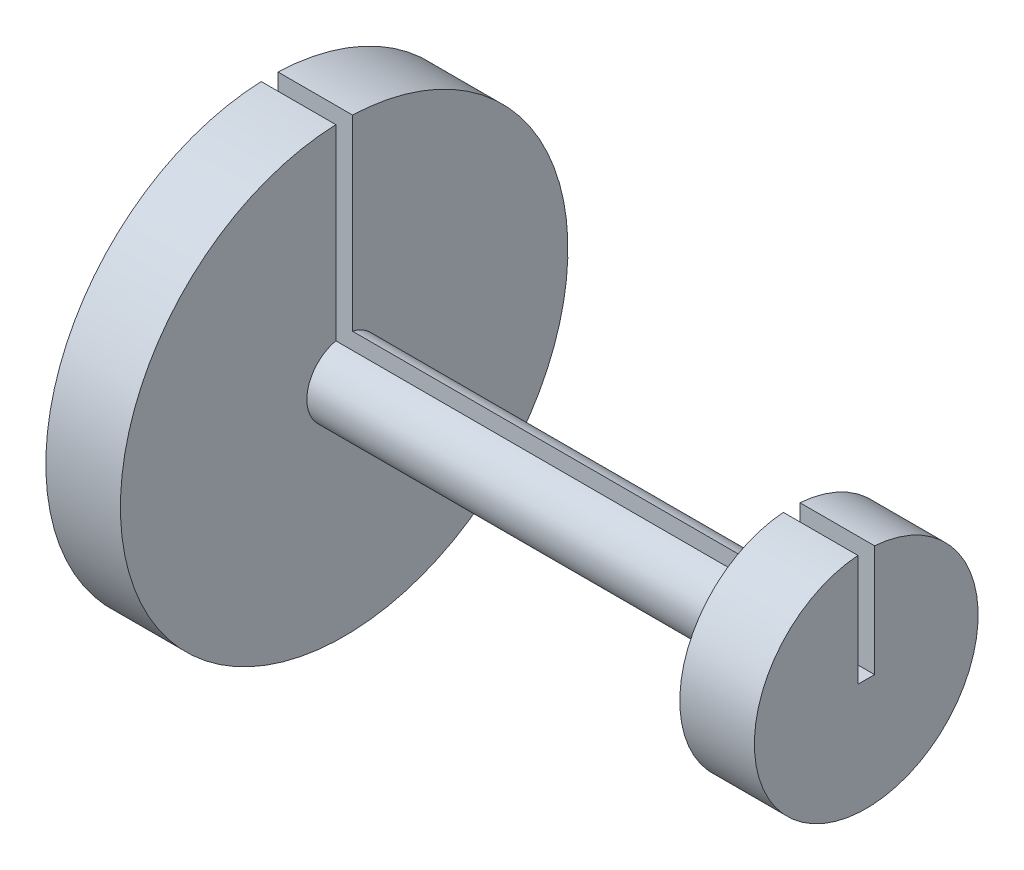
ISO-10303-21;
HEADER;
FILE_DESCRIPTION(('STEP AP214'),'2;1');
FILE_NAME('part.step','',(''),(''),'','','');
FILE_SCHEMA(('AUTOMOTIVE_DESIGN { 1 0 10303 214 1 1 1 1 }'));
ENDSEC;
DATA;
#1=APPLICATION_CONTEXT('core data for automotive mechanical design processes');
#2=APPLICATION_PROTOCOL_DEFINITION('international standard','automotive_design',2000,#1);
#3=PRODUCT_CONTEXT('',#1,'mechanical');
#4=PRODUCT('Part','Part','',(#3));
#5=PRODUCT_RELATED_PRODUCT_CATEGORY('part','',(#4));
#6=PRODUCT_DEFINITION_FORMATION('','',#4);
#7=PRODUCT_DEFINITION_CONTEXT('part definition',#1,'design');
#8=PRODUCT_DEFINITION('design','',#6,#7);
#9=PRODUCT_DEFINITION_SHAPE('','',#8);
#10=(LENGTH_UNIT() NAMED_UNIT(*) SI_UNIT(.MILLI.,.METRE.));
#11=(NAMED_UNIT(*) PLANE_ANGLE_UNIT() SI_UNIT($,.RADIAN.));
#12=(NAMED_UNIT(*) SI_UNIT($,.STERADIAN.) SOLID_ANGLE_UNIT());
#13=UNCERTAINTY_MEASURE_WITH_UNIT(LENGTH_MEASURE(1.E-05),#10,'distance_accuracy_value','');
#14=(GEOMETRIC_REPRESENTATION_CONTEXT(3) GLOBAL_UNCERTAINTY_ASSIGNED_CONTEXT((#13)) GLOBAL_UNIT_ASSIGNED_CONTEXT((#10,
#11,#12)) REPRESENTATION_CONTEXT('',''));
#15=CARTESIAN_POINT('',(0.,0.,0.));
#16=DIRECTION('',(0.,0.,1.));
#17=DIRECTION('',(1.,0.,0.));
#18=AXIS2_PLACEMENT_3D('',#15,#16,#17);
#19=CARTESIAN_POINT('',(0.,0.,0.));
#20=DIRECTION('',(-1.,0.,0.));
#21=DIRECTION('',(0.,0.,1.));
#22=AXIS2_PLACEMENT_3D('',#19,#20,#21);
#23=PLANE('',#22);
#24=DIRECTION('',(0.,-1.,0.));
#25=VECTOR('',#24,1.);
#26=CARTESIAN_POINT('',(0.,0.,1.11656398156038));
#27=LINE('',#26,#25);
#28=CARTESIAN_POINT('',(0.,29.9792142137695,1.11656398156038));
#29=VERTEX_POINT('',#28);
#30=CARTESIAN_POINT('',(0.,0.,1.11656398156038));
#31=VERTEX_POINT('',#30);
#32=EDGE_CURVE('E96',#29,#31,#27,.T.);
#33=ORIENTED_EDGE('',*,*,#32,.T.);
#34=DIRECTION('',(0.,0.,-1.));
#35=VECTOR('',#34,1.);
#36=CARTESIAN_POINT('',(0.,0.,1.11656398156038));
#37=LINE('',#36,#35);
#38=CARTESIAN_POINT('',(0.,0.,-1.11656398156038));
#39=VERTEX_POINT('',#38);
#40=EDGE_CURVE('E103',#31,#39,#37,.T.);
#41=ORIENTED_EDGE('',*,*,#40,.T.);
#42=DIRECTION('',(0.,1.,0.));
#43=VECTOR('',#42,1.);
#44=CARTESIAN_POINT('',(0.,0.,-1.11656398156038));
#45=LINE('',#44,#43);
#46=CARTESIAN_POINT('',(0.,29.9792142137695,-1.11656398156036));
#47=VERTEX_POINT('',#46);
#48=EDGE_CURVE('E100',#39,#47,#45,.T.);
#49=ORIENTED_EDGE('',*,*,#48,.T.);
#50=CARTESIAN_POINT('',(0.,0.,0.));
#51=DIRECTION('',(1.,0.,0.));
#52=DIRECTION('',(0.,0.,-1.));
#53=AXIS2_PLACEMENT_3D('',#50,#51,#52);
#54=CIRCLE('',#53,30.);
#55=EDGE_CURVE('E40',#29,#47,#54,.T.);
#56=ORIENTED_EDGE('',*,*,#55,.F.);
#57=EDGE_LOOP('',(#33,#41,#49,#56));
#58=FACE_BOUND('',#57,.T.);
#59=ADVANCED_FACE('F33',(#58),#23,.T.);
#60=CARTESIAN_POINT('',(80.,0.,0.));
#61=DIRECTION('',(1.,0.,0.));
#62=DIRECTION('',(0.,0.,-1.));
#63=AXIS2_PLACEMENT_3D('',#60,#61,#62);
#64=CYLINDRICAL_SURFACE('',#63,30.);
#65=DIRECTION('',(1.,0.,0.));
#66=VECTOR('',#65,1.);
#67=CARTESIAN_POINT('',(80.,29.9792142137695,1.11656398156038));
#68=LINE('',#67,#66);
#69=CARTESIAN_POINT('',(9.99999999999999,29.9792142137695,1.11656398156038));
#70=VERTEX_POINT('',#69);
#71=EDGE_CURVE('E54',#29,#70,#68,.T.);
#72=ORIENTED_EDGE('',*,*,#71,.F.);
#73=ORIENTED_EDGE('',*,*,#55,.T.);
#74=DIRECTION('',(1.,0.,0.));
#75=VECTOR('',#74,1.);
#76=CARTESIAN_POINT('',(80.,29.9792142137695,-1.11656398156036));
#77=LINE('',#76,#75);
#78=CARTESIAN_POINT('',(9.99999999999999,29.9792142137695,-1.11656398156036));
#79=VERTEX_POINT('',#78);
#80=EDGE_CURVE('E127',#79,#47,#77,.F.);
#81=ORIENTED_EDGE('',*,*,#80,.F.);
#82=CARTESIAN_POINT('',(9.99999999999999,0.,0.));
#83=DIRECTION('',(1.,0.,0.));
#84=DIRECTION('',(0.,0.,-1.));
#85=AXIS2_PLACEMENT_3D('',#82,#83,#84);
#86=CIRCLE('',#85,30.);
#87=EDGE_CURVE('E150',#70,#79,#86,.T.);
#88=ORIENTED_EDGE('',*,*,#87,.F.);
#89=EDGE_LOOP('',(#72,#73,#81,#88));
#90=FACE_BOUND('',#89,.T.);
#91=ADVANCED_FACE('F154',(#90),#64,.T.);
#92=CARTESIAN_POINT('',(10.,30.,0.));
#93=DIRECTION('',(1.,0.,0.));
#94=DIRECTION('',(0.,0.,-1.));
#95=AXIS2_PLACEMENT_3D('',#92,#93,#94);
#96=PLANE('',#95);
#97=DIRECTION('',(0.,-1.,0.));
#98=VECTOR('',#97,1.);
#99=CARTESIAN_POINT('',(10.,30.,1.11656398156038));
#100=LINE('',#99,#98);
#101=CARTESIAN_POINT('',(10.,4.87373418182424,1.11656398156038));
#102=VERTEX_POINT('',#101);
#103=EDGE_CURVE('E135',#70,#102,#100,.T.);
#104=ORIENTED_EDGE('',*,*,#103,.F.);
#105=ORIENTED_EDGE('',*,*,#87,.T.);
#106=DIRECTION('',(0.,1.,0.));
#107=VECTOR('',#106,1.);
#108=CARTESIAN_POINT('',(10.,30.,-1.11656398156036));
#109=LINE('',#108,#107);
#110=CARTESIAN_POINT('',(10.,4.87373418182424,-1.11656398156037));
#111=VERTEX_POINT('',#110);
#112=EDGE_CURVE('E125',#111,#79,#109,.T.);
#113=ORIENTED_EDGE('',*,*,#112,.F.);
#114=CARTESIAN_POINT('',(10.,0.,0.));
#115=DIRECTION('',(1.,0.,0.));
#116=DIRECTION('',(0.,0.,-1.));
#117=AXIS2_PLACEMENT_3D('',#114,#115,#116);
#118=CIRCLE('',#117,4.99999999999999);
#119=EDGE_CURVE('E147',#102,#111,#118,.T.);
#120=ORIENTED_EDGE('',*,*,#119,.F.);
#121=EDGE_LOOP('',(#104,#105,#113,#120));
#122=FACE_BOUND('',#121,.T.);
#123=ADVANCED_FACE('F158',(#122),#96,.T.);
#124=CARTESIAN_POINT('',(80.,0.,0.));
#125=DIRECTION('',(1.,0.,0.));
#126=DIRECTION('',(0.,0.,-1.));
#127=AXIS2_PLACEMENT_3D('',#124,#125,#126);
#128=CYLINDRICAL_SURFACE('',#127,4.99999999999999);
#129=DIRECTION('',(1.,0.,0.));
#130=VECTOR('',#129,1.);
#131=CARTESIAN_POINT('',(80.,4.87373418182424,1.11656398156038));
#132=LINE('',#131,#130);
#133=CARTESIAN_POINT('',(70.,4.87373418182424,1.11656398156038));
#134=VERTEX_POINT('',#133);
#135=EDGE_CURVE('E133',#102,#134,#132,.T.);
#136=ORIENTED_EDGE('',*,*,#135,.F.);
#137=ORIENTED_EDGE('',*,*,#119,.T.);
#138=DIRECTION('',(1.,0.,0.));
#139=VECTOR('',#138,1.);
#140=CARTESIAN_POINT('',(80.,4.87373418182424,-1.11656398156037));
#141=LINE('',#140,#139);
#142=CARTESIAN_POINT('',(70.,4.87373418182424,-1.11656398156037));
#143=VERTEX_POINT('',#142);
#144=EDGE_CURVE('E123',#143,#111,#141,.F.);
#145=ORIENTED_EDGE('',*,*,#144,.F.);
#146=CARTESIAN_POINT('',(70.,0.,0.));
#147=DIRECTION('',(1.,0.,0.));
#148=DIRECTION('',(0.,0.,-1.));
#149=AXIS2_PLACEMENT_3D('',#146,#147,#148);
#150=CIRCLE('',#149,4.99999999999999);
#151=EDGE_CURVE('E144',#134,#143,#150,.T.);
#152=ORIENTED_EDGE('',*,*,#151,.F.);
#153=EDGE_LOOP('',(#136,#137,#145,#152));
#154=FACE_BOUND('',#153,.T.);
#155=ADVANCED_FACE('F164',(#154),#128,.T.);
#156=CARTESIAN_POINT('',(70.,4.99999999999999,0.));
#157=DIRECTION('',(-1.,0.,0.));
#158=DIRECTION('',(0.,0.,1.));
#159=AXIS2_PLACEMENT_3D('',#156,#157,#158);
#160=PLANE('',#159);
#161=DIRECTION('',(0.,1.,0.));
#162=VECTOR('',#161,1.);
#163=CARTESIAN_POINT('',(70.,4.99999999999999,1.11656398156038));
#164=LINE('',#163,#162);
#165=CARTESIAN_POINT('',(70.,14.958385102513,1.11656398156038));
#166=VERTEX_POINT('',#165);
#167=EDGE_CURVE('E131',#134,#166,#164,.T.);
#168=ORIENTED_EDGE('',*,*,#167,.F.);
#169=ORIENTED_EDGE('',*,*,#151,.T.);
#170=DIRECTION('',(0.,-1.,0.));
#171=VECTOR('',#170,1.);
#172=CARTESIAN_POINT('',(70.,4.99999999999999,-1.11656398156037));
#173=LINE('',#172,#171);
#174=CARTESIAN_POINT('',(70.,14.958385102513,-1.11656398156037));
#175=VERTEX_POINT('',#174);
#176=EDGE_CURVE('E121',#175,#143,#173,.T.);
#177=ORIENTED_EDGE('',*,*,#176,.F.);
#178=CARTESIAN_POINT('',(70.,0.,0.));
#179=DIRECTION('',(1.,0.,0.));
#180=DIRECTION('',(0.,0.,-1.));
#181=AXIS2_PLACEMENT_3D('',#178,#179,#180);
#182=CIRCLE('',#181,15.);
#183=EDGE_CURVE('E141',#166,#175,#182,.T.);
#184=ORIENTED_EDGE('',*,*,#183,.F.);
#185=EDGE_LOOP('',(#168,#169,#177,#184));
#186=FACE_BOUND('',#185,.T.);
#187=ADVANCED_FACE('F168',(#186),#160,.T.);
#188=CARTESIAN_POINT('',(80.,0.,0.));
#189=DIRECTION('',(1.,0.,0.));
#190=DIRECTION('',(0.,0.,-1.));
#191=AXIS2_PLACEMENT_3D('',#188,#189,#190);
#192=CYLINDRICAL_SURFACE('',#191,15.);
#193=DIRECTION('',(1.,0.,0.));
#194=VECTOR('',#193,1.);
#195=CARTESIAN_POINT('',(80.,14.958385102513,1.11656398156038));
#196=LINE('',#195,#194);
#197=CARTESIAN_POINT('',(80.,14.958385102513,1.11656398156038));
#198=VERTEX_POINT('',#197);
#199=EDGE_CURVE('E129',#166,#198,#196,.T.);
#200=ORIENTED_EDGE('',*,*,#199,.F.);
#201=ORIENTED_EDGE('',*,*,#183,.T.);
#202=DIRECTION('',(1.,0.,0.));
#203=VECTOR('',#202,1.);
#204=CARTESIAN_POINT('',(80.,14.958385102513,-1.11656398156037));
#205=LINE('',#204,#203);
#206=CARTESIAN_POINT('',(80.,14.958385102513,-1.11656398156037));
#207=VERTEX_POINT('',#206);
#208=EDGE_CURVE('E118',#207,#175,#205,.F.);
#209=ORIENTED_EDGE('',*,*,#208,.F.);
#210=CARTESIAN_POINT('',(80.,0.,0.));
#211=DIRECTION('',(1.,0.,0.));
#212=DIRECTION('',(0.,0.,-1.));
#213=AXIS2_PLACEMENT_3D('',#210,#211,#212);
#214=CIRCLE('',#213,15.);
#215=EDGE_CURVE('E138',#198,#207,#214,.T.);
#216=ORIENTED_EDGE('',*,*,#215,.F.);
#217=EDGE_LOOP('',(#200,#201,#209,#216));
#218=FACE_BOUND('',#217,.T.);
#219=ADVANCED_FACE('F173',(#218),#192,.T.);
#220=CARTESIAN_POINT('',(80.,15.,0.));
#221=DIRECTION('',(1.,0.,0.));
#222=DIRECTION('',(0.,0.,-1.));
#223=AXIS2_PLACEMENT_3D('',#220,#221,#222);
#224=PLANE('',#223);
#225=DIRECTION('',(0.,-1.,0.));
#226=VECTOR('',#225,1.);
#227=CARTESIAN_POINT('',(80.,15.,1.11656398156038));
#228=LINE('',#227,#226);
#229=CARTESIAN_POINT('',(80.,0.,1.11656398156038));
#230=VERTEX_POINT('',#229);
#231=EDGE_CURVE('E11',#198,#230,#228,.T.);
#232=ORIENTED_EDGE('',*,*,#231,.F.);
#233=ORIENTED_EDGE('',*,*,#215,.T.);
#234=DIRECTION('',(0.,1.,0.));
#235=VECTOR('',#234,1.);
#236=CARTESIAN_POINT('',(80.,0.,-1.11656398156038));
#237=LINE('',#236,#235);
#238=CARTESIAN_POINT('',(80.,0.,-1.11656398156038));
#239=VERTEX_POINT('',#238);
#240=EDGE_CURVE('E111',#239,#207,#237,.T.);
#241=ORIENTED_EDGE('',*,*,#240,.F.);
#242=DIRECTION('',(0.,0.,-1.));
#243=VECTOR('',#242,1.);
#244=CARTESIAN_POINT('',(80.,0.,1.11656398156038));
#245=LINE('',#244,#243);
#246=EDGE_CURVE('E113',#230,#239,#245,.T.);
#247=ORIENTED_EDGE('',*,*,#246,.F.);
#248=EDGE_LOOP('',(#232,#233,#241,#247));
#249=FACE_BOUND('',#248,.T.);
#250=ADVANCED_FACE('F177',(#249),#224,.T.);
#251=CARTESIAN_POINT('',(0.,0.,1.11656398156038));
#252=DIRECTION('',(0.,0.,1.));
#253=DIRECTION('',(1.,0.,0.));
#254=AXIS2_PLACEMENT_3D('',#251,#252,#253);
#255=PLANE('',#254);
#256=ORIENTED_EDGE('',*,*,#71,.T.);
#257=ORIENTED_EDGE('',*,*,#103,.T.);
#258=ORIENTED_EDGE('',*,*,#135,.T.);
#259=ORIENTED_EDGE('',*,*,#167,.T.);
#260=ORIENTED_EDGE('',*,*,#199,.T.);
#261=ORIENTED_EDGE('',*,*,#231,.T.);
#262=DIRECTION('',(1.,0.,0.));
#263=VECTOR('',#262,1.);
#264=CARTESIAN_POINT('',(0.,0.,1.11656398156038));
#265=LINE('',#264,#263);
#266=EDGE_CURVE('E47',#31,#230,#265,.T.);
#267=ORIENTED_EDGE('',*,*,#266,.F.);
#268=ORIENTED_EDGE('',*,*,#32,.F.);
#269=EDGE_LOOP('',(#256,#257,#258,#259,#260,#261,#267,#268));
#270=FACE_BOUND('',#269,.T.);
#271=ADVANCED_FACE('F94',(#270),#255,.F.);
#272=CARTESIAN_POINT('',(0.,0.,-1.11656398156038));
#273=DIRECTION('',(0.,0.,-1.));
#274=DIRECTION('',(0.,1.,0.));
#275=AXIS2_PLACEMENT_3D('',#272,#273,#274);
#276=PLANE('',#275);
#277=ORIENTED_EDGE('',*,*,#80,.T.);
#278=ORIENTED_EDGE('',*,*,#48,.F.);
#279=DIRECTION('',(1.,0.,0.));
#280=VECTOR('',#279,1.);
#281=CARTESIAN_POINT('',(0.,0.,-1.11656398156038));
#282=LINE('',#281,#280);
#283=EDGE_CURVE('E99',#39,#239,#282,.T.);
#284=ORIENTED_EDGE('',*,*,#283,.T.);
#285=ORIENTED_EDGE('',*,*,#240,.T.);
#286=ORIENTED_EDGE('',*,*,#208,.T.);
#287=ORIENTED_EDGE('',*,*,#176,.T.);
#288=ORIENTED_EDGE('',*,*,#144,.T.);
#289=ORIENTED_EDGE('',*,*,#112,.T.);
#290=EDGE_LOOP('',(#277,#278,#284,#285,#286,#287,#288,#289));
#291=FACE_BOUND('',#290,.T.);
#292=ADVANCED_FACE('F179',(#291),#276,.F.);
#293=CARTESIAN_POINT('',(0.,0.,1.11656398156038));
#294=DIRECTION('',(0.,-1.,0.));
#295=DIRECTION('',(0.,0.,-1.));
#296=AXIS2_PLACEMENT_3D('',#293,#294,#295);
#297=PLANE('',#296);
#298=ORIENTED_EDGE('',*,*,#246,.T.);
#299=ORIENTED_EDGE('',*,*,#283,.F.);
#300=ORIENTED_EDGE('',*,*,#40,.F.);
#301=ORIENTED_EDGE('',*,*,#266,.T.);
#302=EDGE_LOOP('',(#298,#299,#300,#301));
#303=FACE_BOUND('',#302,.T.);
#304=ADVANCED_FACE('F104',(#303),#297,.F.);
#305=CLOSED_SHELL('',(#59,#91,#123,#155,#187,#219,#250,#271,#292,#304));
#306=MANIFOLD_SOLID_BREP('B2',#305);
#307=ADVANCED_BREP_SHAPE_REPRESENTATION('',(#18,#306),#14);
#308=SHAPE_DEFINITION_REPRESENTATION(#9,#307);
ENDSEC;
END-ISO-10303-21;
